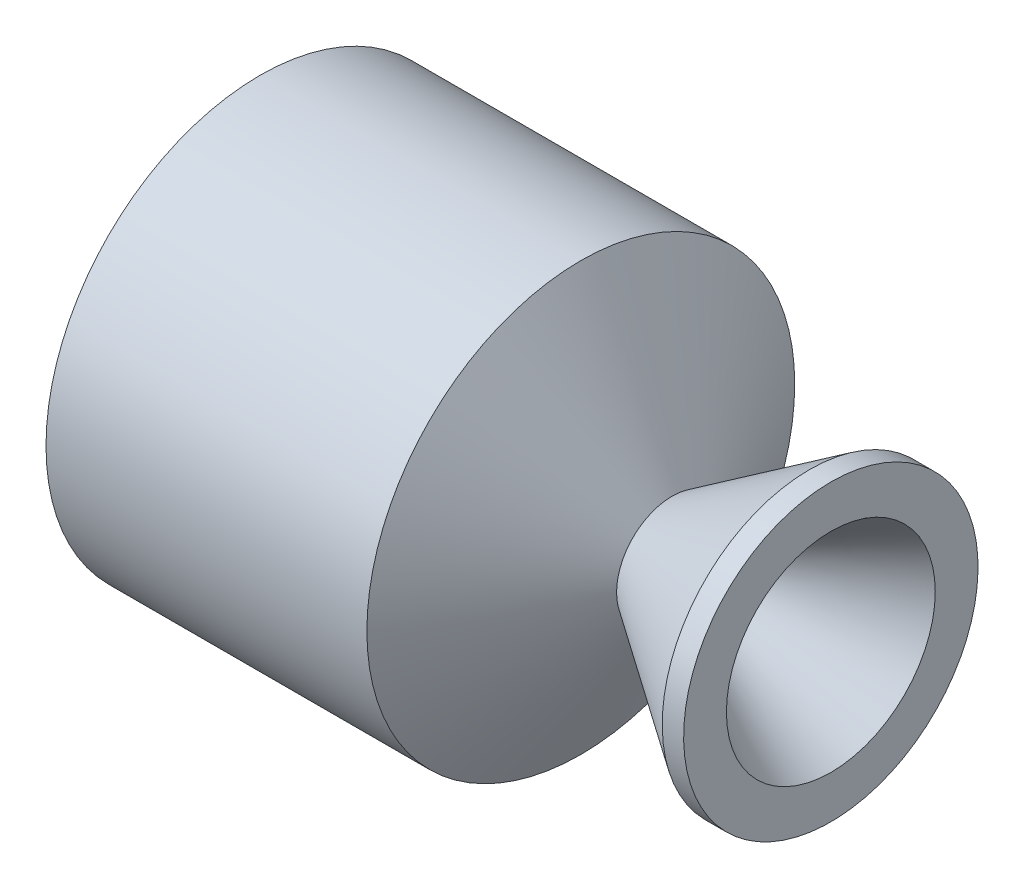
ISO-10303-21;
HEADER;
FILE_DESCRIPTION(('STEP AP214'),'2;1');
FILE_NAME('part.step','',(''),(''),'','','');
FILE_SCHEMA(('AUTOMOTIVE_DESIGN { 1 0 10303 214 1 1 1 1 }'));
ENDSEC;
DATA;
#1=APPLICATION_CONTEXT('core data for automotive mechanical design processes');
#2=APPLICATION_PROTOCOL_DEFINITION('international standard','automotive_design',2000,#1);
#3=PRODUCT_CONTEXT('',#1,'mechanical');
#4=PRODUCT('Part','Part','',(#3));
#5=PRODUCT_RELATED_PRODUCT_CATEGORY('part','',(#4));
#6=PRODUCT_DEFINITION_FORMATION('','',#4);
#7=PRODUCT_DEFINITION_CONTEXT('part definition',#1,'design');
#8=PRODUCT_DEFINITION('design','',#6,#7);
#9=PRODUCT_DEFINITION_SHAPE('','',#8);
#10=(LENGTH_UNIT() NAMED_UNIT(*) SI_UNIT(.MILLI.,.METRE.));
#11=(NAMED_UNIT(*) PLANE_ANGLE_UNIT() SI_UNIT($,.RADIAN.));
#12=(NAMED_UNIT(*) SI_UNIT($,.STERADIAN.) SOLID_ANGLE_UNIT());
#13=UNCERTAINTY_MEASURE_WITH_UNIT(LENGTH_MEASURE(1.E-05),#10,'distance_accuracy_value','');
#14=(GEOMETRIC_REPRESENTATION_CONTEXT(3) GLOBAL_UNCERTAINTY_ASSIGNED_CONTEXT((#13)) GLOBAL_UNIT_ASSIGNED_CONTEXT((#10,
#11,#12)) REPRESENTATION_CONTEXT('',''));
#15=CARTESIAN_POINT('',(0.,0.,0.));
#16=DIRECTION('',(0.,0.,1.));
#17=DIRECTION('',(1.,0.,0.));
#18=AXIS2_PLACEMENT_3D('',#15,#16,#17);
#19=CARTESIAN_POINT('',(-4.84974226119283,0.,0.));
#20=DIRECTION('',(-1.,0.,0.));
#21=DIRECTION('',(0.,-1.,0.));
#22=AXIS2_PLACEMENT_3D('',#19,#20,#21);
#23=CONICAL_SURFACE('',#22,8.99999999999999,1.0471975511966);
#24=CARTESIAN_POINT('',(0.,0.,0.));
#25=DIRECTION('',(1.,0.,0.));
#26=DIRECTION('',(0.,1.,0.));
#27=AXIS2_PLACEMENT_3D('',#24,#25,#26);
#28=CIRCLE('',#27,0.6);
#29=CARTESIAN_POINT('',(0.,-0.599999999999998,0.));
#30=VERTEX_POINT('',#29);
#31=EDGE_CURVE('E90',#30,#30,#28,.T.);
#32=CARTESIAN_POINT('',(-4.84974226119283,0.,0.));
#33=DIRECTION('',(1.,0.,0.));
#34=DIRECTION('',(0.,1.,0.));
#35=AXIS2_PLACEMENT_3D('',#32,#33,#34);
#36=CIRCLE('',#35,9.);
#37=CARTESIAN_POINT('',(-4.84974226119283,-8.99999999999999,0.));
#38=VERTEX_POINT('',#37);
#39=EDGE_CURVE('E10',#38,#38,#36,.T.);
#40=CARTESIAN_POINT('',(0.,-0.599999999999998,0.));
#41=CARTESIAN_POINT('',(-0.0505181485540921,-0.687499999999998,0.));
#42=CARTESIAN_POINT('',(-0.101036297108184,-0.774999999999999,0.));
#43=CARTESIAN_POINT('',(-0.202072594216368,-0.949999999999999,0.));
#44=CARTESIAN_POINT('',(-0.25259074277046,-1.0375,0.));
#45=CARTESIAN_POINT('',(-0.353627039878644,-1.2125,0.));
#46=CARTESIAN_POINT('',(-0.404145188432736,-1.3,0.));
#47=CARTESIAN_POINT('',(-0.505181485540919,-1.475,0.));
#48=CARTESIAN_POINT('',(-0.555699634095012,-1.5625,0.));
#49=CARTESIAN_POINT('',(-0.656735931203196,-1.7375,0.));
#50=CARTESIAN_POINT('',(-0.707254079757288,-1.825,0.));
#51=CARTESIAN_POINT('',(-0.808290376865472,-2.,0.));
#52=CARTESIAN_POINT('',(-0.858808525419564,-2.0875,0.));
#53=CARTESIAN_POINT('',(-0.959844822527748,-2.2625,0.));
#54=CARTESIAN_POINT('',(-1.01036297108184,-2.35,0.));
#55=CARTESIAN_POINT('',(-1.11139926819002,-2.525,0.));
#56=CARTESIAN_POINT('',(-1.16191741674412,-2.6125,0.));
#57=CARTESIAN_POINT('',(-1.2629537138523,-2.7875,0.));
#58=CARTESIAN_POINT('',(-1.31347186240639,-2.875,0.));
#59=CARTESIAN_POINT('',(-1.41450815951458,-3.05,0.));
#60=CARTESIAN_POINT('',(-1.46502630806867,-3.1375,0.));
#61=CARTESIAN_POINT('',(-1.56606260517685,-3.3125,0.));
#62=CARTESIAN_POINT('',(-1.61658075373094,-3.4,0.));
#63=CARTESIAN_POINT('',(-1.71761705083913,-3.575,0.));
#64=CARTESIAN_POINT('',(-1.76813519939322,-3.6625,0.));
#65=CARTESIAN_POINT('',(-1.8691714965014,-3.8375,0.));
#66=CARTESIAN_POINT('',(-1.9196896450555,-3.925,0.));
#67=CARTESIAN_POINT('',(-2.02072594216368,-4.1,0.));
#68=CARTESIAN_POINT('',(-2.07124409071777,-4.1875,0.));
#69=CARTESIAN_POINT('',(-2.17228038782596,-4.3625,0.));
#70=CARTESIAN_POINT('',(-2.22279853638005,-4.45,0.));
#71=CARTESIAN_POINT('',(-2.32383483348823,-4.625,0.));
#72=CARTESIAN_POINT('',(-2.37435298204232,-4.7125,0.));
#73=CARTESIAN_POINT('',(-2.47538927915051,-4.8875,0.));
#74=CARTESIAN_POINT('',(-2.5259074277046,-4.975,0.));
#75=CARTESIAN_POINT('',(-2.62694372481278,-5.15,0.));
#76=CARTESIAN_POINT('',(-2.67746187336688,-5.23749999999999,0.));
#77=CARTESIAN_POINT('',(-2.77849817047506,-5.41249999999999,0.));
#78=CARTESIAN_POINT('',(-2.82901631902915,-5.49999999999999,0.));
#79=CARTESIAN_POINT('',(-2.93005261613734,-5.67499999999999,0.));
#80=CARTESIAN_POINT('',(-2.98057076469143,-5.76249999999999,0.));
#81=CARTESIAN_POINT('',(-3.08160706179961,-5.93749999999999,0.));
#82=CARTESIAN_POINT('',(-3.1321252103537,-6.025,0.));
#83=CARTESIAN_POINT('',(-3.23316150746189,-6.19999999999999,0.));
#84=CARTESIAN_POINT('',(-3.28367965601598,-6.28749999999999,0.));
#85=CARTESIAN_POINT('',(-3.38471595312416,-6.46249999999999,0.));
#86=CARTESIAN_POINT('',(-3.43523410167826,-6.54999999999999,0.));
#87=CARTESIAN_POINT('',(-3.53627039878644,-6.72499999999999,0.));
#88=CARTESIAN_POINT('',(-3.58678854734053,-6.81249999999999,0.));
#89=CARTESIAN_POINT('',(-3.68782484444872,-6.98749999999999,0.));
#90=CARTESIAN_POINT('',(-3.73834299300281,-7.07499999999999,0.));
#91=CARTESIAN_POINT('',(-3.83937929011099,-7.24999999999999,0.));
#92=CARTESIAN_POINT('',(-3.88989743866508,-7.33749999999999,0.));
#93=CARTESIAN_POINT('',(-3.99093373577327,-7.51249999999999,0.));
#94=CARTESIAN_POINT('',(-4.04145188432736,-7.59999999999999,0.));
#95=CARTESIAN_POINT('',(-4.14248818143554,-7.77499999999999,0.));
#96=CARTESIAN_POINT('',(-4.19300632998964,-7.86249999999999,0.));
#97=CARTESIAN_POINT('',(-4.29404262709782,-8.03749999999999,0.));
#98=CARTESIAN_POINT('',(-4.34456077565191,-8.12499999999999,0.));
#99=CARTESIAN_POINT('',(-4.4455970727601,-8.29999999999999,0.));
#100=CARTESIAN_POINT('',(-4.49611522131419,-8.38749999999999,0.));
#101=CARTESIAN_POINT('',(-4.59715151842237,-8.56249999999999,0.));
#102=CARTESIAN_POINT('',(-4.64766966697646,-8.64999999999999,0.));
#103=CARTESIAN_POINT('',(-4.74870596408465,-8.82499999999999,0.));
#104=CARTESIAN_POINT('',(-4.79922411263874,-8.91249999999999,0.));
#105=CARTESIAN_POINT('',(-4.84974226119283,-8.99999999999999,0.));
#106=B_SPLINE_CURVE_WITH_KNOTS('',3,(#40,#41,#42,#43,#44,#45,#46,#47,#48,#49,#50,#51,#52,#53,
#54,#55,#56,#57,#58,#59,#60,#61,#62,#63,#64,#65,#66,#67,#68,#69,#70,#71,#72,#73,#74,#75,#76,#77,
#78,#79,#80,#81,#82,#83,#84,#85,#86,#87,#88,#89,#90,#91,#92,#93,#94,#95,#96,#97,#98,#99,#100,
#101,#102,#103,#104,#105),.UNSPECIFIED.,.F.,.F.,(4,2,2,2,2,2,2,2,2,2,2,2,2,2,2,2,2,2,2,2,2,2,2,
2,2,2,2,2,2,2,2,2,4),(0.,0.303108891324554,0.606217782649107,0.909326673973658,1.21243556529821,
1.51554445662276,1.81865334794732,2.12176223927187,2.42487113059642,2.72798002192098,
3.03108891324553,3.33419780457008,3.63730669589464,3.94041558721919,4.24352447854374,
4.54663336986829,4.84974226119285,5.1528511525174,5.45596004384195,5.75906893516651,
6.06217782649106,6.36528671781561,6.66839560914017,6.97150450046472,7.27461339178927,
7.57772228311383,7.88083117443838,8.18394006576293,8.48704895708748,8.79015784841204,
9.09326673973659,9.39637563106114,9.6994845223857),.UNSPECIFIED.);
#107=EDGE_CURVE('BSEAM43',#30,#38,#106,.T.);
#108=ORIENTED_EDGE('',*,*,#31,.T.);
#109=ORIENTED_EDGE('',*,*,#39,.F.);
#110=ORIENTED_EDGE('',*,*,#107,.T.);
#111=ORIENTED_EDGE('',*,*,#107,.F.);
#112=EDGE_LOOP('',(#108,#110,#109,#111));
#113=FACE_BOUND('',#112,.T.);
#114=ADVANCED_FACE('F43',(#113),#23,.F.);
#115=CARTESIAN_POINT('',(7.41583083989624,0.,0.));
#116=DIRECTION('',(1.,0.,0.));
#117=DIRECTION('',(0.,1.,0.));
#118=AXIS2_PLACEMENT_3D('',#115,#116,#117);
#119=CYLINDRICAL_SURFACE('',#118,8.99999999999999);
#120=ORIENTED_EDGE('',*,*,#39,.T.);
#121=EDGE_LOOP('',(#120));
#122=FACE_BOUND('',#121,.T.);
#123=CARTESIAN_POINT('',(-18.2723919920032,0.,0.));
#124=DIRECTION('',(1.,0.,0.));
#125=DIRECTION('',(0.,1.,0.));
#126=AXIS2_PLACEMENT_3D('',#123,#124,#125);
#127=CIRCLE('',#126,8.99999999999999);
#128=CARTESIAN_POINT('',(-18.2723919920032,9.,0.));
#129=VERTEX_POINT('',#128);
#130=EDGE_CURVE('E50',#129,#129,#127,.T.);
#131=ORIENTED_EDGE('',*,*,#130,.F.);
#132=EDGE_LOOP('',(#131));
#133=FACE_BOUND('',#132,.T.);
#134=ADVANCED_FACE('F109',(#122,#133),#119,.F.);
#135=CARTESIAN_POINT('',(-18.2723919920032,9.,0.));
#136=DIRECTION('',(1.,0.,0.));
#137=DIRECTION('',(0.,1.,0.));
#138=AXIS2_PLACEMENT_3D('',#135,#136,#137);
#139=PLANE('',#138);
#140=ORIENTED_EDGE('',*,*,#130,.T.);
#141=EDGE_LOOP('',(#140));
#142=FACE_BOUND('',#141,.T.);
#143=CARTESIAN_POINT('',(-18.2723919920032,0.,0.));
#144=DIRECTION('',(1.,0.,0.));
#145=DIRECTION('',(0.,1.,0.));
#146=AXIS2_PLACEMENT_3D('',#143,#144,#145);
#147=CIRCLE('',#146,0.599999999999996);
#148=CARTESIAN_POINT('',(-18.2723919920032,0.6,0.));
#149=VERTEX_POINT('',#148);
#150=EDGE_CURVE('E55',#149,#149,#147,.T.);
#151=ORIENTED_EDGE('',*,*,#150,.F.);
#152=EDGE_LOOP('',(#151));
#153=FACE_BOUND('',#152,.T.);
#154=ADVANCED_FACE('F113',(#142,#153),#139,.T.);
#155=CARTESIAN_POINT('',(7.41583083989624,0.,0.));
#156=DIRECTION('',(1.,0.,0.));
#157=DIRECTION('',(0.,1.,0.));
#158=AXIS2_PLACEMENT_3D('',#155,#156,#157);
#159=CYLINDRICAL_SURFACE('',#158,0.599999999999996);
#160=ORIENTED_EDGE('',*,*,#150,.T.);
#161=EDGE_LOOP('',(#160));
#162=FACE_BOUND('',#161,.T.);
#163=CARTESIAN_POINT('',(-19.2723919920032,0.,0.));
#164=DIRECTION('',(1.,0.,0.));
#165=DIRECTION('',(0.,1.,0.));
#166=AXIS2_PLACEMENT_3D('',#163,#164,#165);
#167=CIRCLE('',#166,0.599999999999996);
#168=CARTESIAN_POINT('',(-19.2723919920032,0.6,0.));
#169=VERTEX_POINT('',#168);
#170=EDGE_CURVE('E60',#169,#169,#167,.T.);
#171=ORIENTED_EDGE('',*,*,#170,.F.);
#172=EDGE_LOOP('',(#171));
#173=FACE_BOUND('',#172,.T.);
#174=ADVANCED_FACE('F117',(#162,#173),#159,.F.);
#175=CARTESIAN_POINT('',(-19.2723919920032,10.,0.));
#176=DIRECTION('',(-1.,0.,0.));
#177=DIRECTION('',(0.,-1.,0.));
#178=AXIS2_PLACEMENT_3D('',#175,#176,#177);
#179=PLANE('',#178);
#180=ORIENTED_EDGE('',*,*,#170,.T.);
#181=EDGE_LOOP('',(#180));
#182=FACE_BOUND('',#181,.T.);
#183=CARTESIAN_POINT('',(-19.2723919920032,0.,0.));
#184=DIRECTION('',(1.,0.,0.));
#185=DIRECTION('',(0.,1.,0.));
#186=AXIS2_PLACEMENT_3D('',#183,#184,#185);
#187=CIRCLE('',#186,9.99999999999999);
#188=CARTESIAN_POINT('',(-19.2723919920032,10.,0.));
#189=VERTEX_POINT('',#188);
#190=EDGE_CURVE('E66',#189,#189,#187,.T.);
#191=ORIENTED_EDGE('',*,*,#190,.F.);
#192=EDGE_LOOP('',(#191));
#193=FACE_BOUND('',#192,.T.);
#194=ADVANCED_FACE('F123',(#182,#193),#179,.T.);
#195=CARTESIAN_POINT('',(7.41583083989624,0.,0.));
#196=DIRECTION('',(1.,0.,0.));
#197=DIRECTION('',(0.,1.,0.));
#198=AXIS2_PLACEMENT_3D('',#195,#196,#197);
#199=CYLINDRICAL_SURFACE('',#198,9.99999999999999);
#200=ORIENTED_EDGE('',*,*,#190,.T.);
#201=EDGE_LOOP('',(#200));
#202=FACE_BOUND('',#201,.T.);
#203=CARTESIAN_POINT('',(-4.27239199200321,0.,0.));
#204=DIRECTION('',(1.,0.,0.));
#205=DIRECTION('',(0.,1.,0.));
#206=AXIS2_PLACEMENT_3D('',#203,#204,#205);
#207=CIRCLE('',#206,10.);
#208=CARTESIAN_POINT('',(-4.27239199200321,-10.,0.));
#209=VERTEX_POINT('',#208);
#210=EDGE_CURVE('E70',#209,#209,#207,.T.);
#211=ORIENTED_EDGE('',*,*,#210,.F.);
#212=EDGE_LOOP('',(#211));
#213=FACE_BOUND('',#212,.T.);
#214=ADVANCED_FACE('F127',(#202,#213),#199,.T.);
#215=CARTESIAN_POINT('',(0.,0.,0.));
#216=DIRECTION('',(-1.,0.,0.));
#217=DIRECTION('',(0.,-1.,0.));
#218=AXIS2_PLACEMENT_3D('',#215,#216,#217);
#219=CONICAL_SURFACE('',#218,2.6,1.0471975511966);
#220=CARTESIAN_POINT('',(0.,0.,0.));
#221=DIRECTION('',(1.,0.,0.));
#222=DIRECTION('',(0.,1.,0.));
#223=AXIS2_PLACEMENT_3D('',#220,#221,#222);
#224=CIRCLE('',#223,2.6);
#225=CARTESIAN_POINT('',(0.,-2.6,0.));
#226=VERTEX_POINT('',#225);
#227=EDGE_CURVE('E74',#226,#226,#224,.T.);
#228=CARTESIAN_POINT('',(-4.27239199200321,-10.,0.));
#229=CARTESIAN_POINT('',(-4.22788790875318,-9.92291666666667,0.));
#230=CARTESIAN_POINT('',(-4.18338382550315,-9.84583333333333,0.));
#231=CARTESIAN_POINT('',(-4.09437565900308,-9.69166666666667,0.));
#232=CARTESIAN_POINT('',(-4.04987157575304,-9.61458333333333,0.));
#233=CARTESIAN_POINT('',(-3.96086340925298,-9.46041666666666,0.));
#234=CARTESIAN_POINT('',(-3.91635932600294,-9.38333333333333,0.));
#235=CARTESIAN_POINT('',(-3.82735115950288,-9.22916666666666,0.));
#236=CARTESIAN_POINT('',(-3.78284707625284,-9.15208333333333,0.));
#237=CARTESIAN_POINT('',(-3.69383890975278,-8.99791666666667,0.));
#238=CARTESIAN_POINT('',(-3.64933482650274,-8.92083333333333,0.));
#239=CARTESIAN_POINT('',(-3.56032666000268,-8.76666666666667,0.));
#240=CARTESIAN_POINT('',(-3.51582257675264,-8.68958333333333,0.));
#241=CARTESIAN_POINT('',(-3.42681441025258,-8.53541666666666,0.));
#242=CARTESIAN_POINT('',(-3.38231032700254,-8.45833333333333,0.));
#243=CARTESIAN_POINT('',(-3.29330216050248,-8.30416666666667,0.));
#244=CARTESIAN_POINT('',(-3.24879807725244,-8.22708333333333,0.));
#245=CARTESIAN_POINT('',(-3.15978991075238,-8.07291666666667,0.));
#246=CARTESIAN_POINT('',(-3.11528582750234,-7.99583333333333,0.));
#247=CARTESIAN_POINT('',(-3.02627766100228,-7.84166666666667,0.));
#248=CARTESIAN_POINT('',(-2.98177357775224,-7.76458333333333,0.));
#249=CARTESIAN_POINT('',(-2.89276541125218,-7.61041666666667,0.));
#250=CARTESIAN_POINT('',(-2.84826132800214,-7.53333333333333,0.));
#251=CARTESIAN_POINT('',(-2.75925316150208,-7.37916666666667,0.));
#252=CARTESIAN_POINT('',(-2.71474907825204,-7.30208333333333,0.));
#253=CARTESIAN_POINT('',(-2.62574091175197,-7.14791666666667,0.));
#254=CARTESIAN_POINT('',(-2.58123682850194,-7.07083333333333,0.));
#255=CARTESIAN_POINT('',(-2.49222866200187,-6.91666666666666,0.));
#256=CARTESIAN_POINT('',(-2.44772457875184,-6.83958333333333,0.));
#257=CARTESIAN_POINT('',(-2.35871641225177,-6.68541666666667,0.));
#258=CARTESIAN_POINT('',(-2.31421232900174,-6.60833333333333,0.));
#259=CARTESIAN_POINT('',(-2.22520416250167,-6.45416666666667,0.));
#260=CARTESIAN_POINT('',(-2.18070007925164,-6.37708333333333,0.));
#261=CARTESIAN_POINT('',(-2.09169191275157,-6.22291666666667,0.));
#262=CARTESIAN_POINT('',(-2.04718782950154,-6.14583333333333,0.));
#263=CARTESIAN_POINT('',(-1.95817966300147,-5.99166666666667,0.));
#264=CARTESIAN_POINT('',(-1.91367557975144,-5.91458333333333,0.));
#265=CARTESIAN_POINT('',(-1.82466741325137,-5.76041666666667,0.));
#266=CARTESIAN_POINT('',(-1.78016333000134,-5.68333333333333,0.));
#267=CARTESIAN_POINT('',(-1.69115516350127,-5.52916666666667,0.));
#268=CARTESIAN_POINT('',(-1.64665108025124,-5.45208333333333,0.));
#269=CARTESIAN_POINT('',(-1.55764291375117,-5.29791666666667,0.));
#270=CARTESIAN_POINT('',(-1.51313883050114,-5.22083333333333,0.));
#271=CARTESIAN_POINT('',(-1.42413066400107,-5.06666666666667,0.));
#272=CARTESIAN_POINT('',(-1.37962658075104,-4.98958333333333,0.));
#273=CARTESIAN_POINT('',(-1.29061841425097,-4.83541666666667,0.));
#274=CARTESIAN_POINT('',(-1.24611433100094,-4.75833333333333,0.));
#275=CARTESIAN_POINT('',(-1.15710616450087,-4.60416666666667,0.));
#276=CARTESIAN_POINT('',(-1.11260208125084,-4.52708333333333,0.));
#277=CARTESIAN_POINT('',(-1.02359391475077,-4.37291666666667,0.));
#278=CARTESIAN_POINT('',(-0.979089831500737,-4.29583333333333,0.));
#279=CARTESIAN_POINT('',(-0.89008166500067,-4.14166666666667,0.));
#280=CARTESIAN_POINT('',(-0.845577581750637,-4.06458333333333,0.));
#281=CARTESIAN_POINT('',(-0.75656941525057,-3.91041666666667,0.));
#282=CARTESIAN_POINT('',(-0.712065332000537,-3.83333333333333,0.));
#283=CARTESIAN_POINT('',(-0.62305716550047,-3.67916666666667,0.));
#284=CARTESIAN_POINT('',(-0.578553082250436,-3.60208333333333,0.));
#285=CARTESIAN_POINT('',(-0.489544915750369,-3.44791666666667,0.));
#286=CARTESIAN_POINT('',(-0.445040832500336,-3.37083333333333,0.));
#287=CARTESIAN_POINT('',(-0.356032666000269,-3.21666666666667,0.));
#288=CARTESIAN_POINT('',(-0.311528582750236,-3.13958333333333,0.));
#289=CARTESIAN_POINT('',(-0.222520416250169,-2.98541666666667,0.));
#290=CARTESIAN_POINT('',(-0.178016333000135,-2.90833333333333,0.));
#291=CARTESIAN_POINT('',(-0.0890081665000683,-2.75416666666667,0.));
#292=CARTESIAN_POINT('',(-0.0445040832500348,-2.67708333333333,0.));
#293=CARTESIAN_POINT('',(0.,-2.6,0.));
#294=B_SPLINE_CURVE_WITH_KNOTS('',3,(#228,#229,#230,#231,#232,#233,#234,#235,#236,#237,#238,
#239,#240,#241,#242,#243,#244,#245,#246,#247,#248,#249,#250,#251,#252,#253,#254,#255,#256,#257,
#258,#259,#260,#261,#262,#263,#264,#265,#266,#267,#268,#269,#270,#271,#272,#273,#274,#275,#276,
#277,#278,#279,#280,#281,#282,#283,#284,#285,#286,#287,#288,#289,#290,#291,#292,#293),
.UNSPECIFIED.,.F.,.F.,(4,2,2,2,2,2,2,2,2,2,2,2,2,2,2,2,2,2,2,2,2,2,2,2,2,2,2,2,2,2,2,2,4),(0.,
0.267024499500201,0.534048999000404,0.801073498500605,1.06809799800081,1.33512249750101,
1.60214699700121,1.86917149650141,2.13619599600161,2.40322049550181,2.67024499500202,
2.93726949450222,3.20429399400242,3.47131849350262,3.73834299300282,4.00536749250302,
4.27239199200322,4.53941649150343,4.80644099100363,5.07346549050383,5.34048999000403,
5.60751448950423,5.87453898900443,6.14156348850463,6.40858798800483,6.67561248750504,
6.94263698700524,7.20966148650544,7.47668598600564,7.74371048550584,8.01073498500604,
8.27775948450624,8.54478398400645),.UNSPECIFIED.);
#295=EDGE_CURVE('BSEAM131',#209,#226,#294,.T.);
#296=ORIENTED_EDGE('',*,*,#210,.T.);
#297=ORIENTED_EDGE('',*,*,#227,.F.);
#298=ORIENTED_EDGE('',*,*,#295,.T.);
#299=ORIENTED_EDGE('',*,*,#295,.F.);
#300=EDGE_LOOP('',(#296,#298,#297,#299));
#301=FACE_BOUND('',#300,.T.);
#302=ADVANCED_FACE('F131',(#301),#219,.T.);
#303=CARTESIAN_POINT('',(6.41583083989624,0.,0.));
#304=DIRECTION('',(1.,0.,0.));
#305=DIRECTION('',(0.,1.,0.));
#306=AXIS2_PLACEMENT_3D('',#303,#304,#305);
#307=CONICAL_SURFACE('',#306,6.88153193167882,0.588467682855342);
#308=ORIENTED_EDGE('',*,*,#227,.T.);
#309=EDGE_LOOP('',(#308));
#310=FACE_BOUND('',#309,.T.);
#311=CARTESIAN_POINT('',(6.41583083989624,0.,0.));
#312=DIRECTION('',(1.,0.,0.));
#313=DIRECTION('',(0.,1.,0.));
#314=AXIS2_PLACEMENT_3D('',#311,#312,#313);
#315=CIRCLE('',#314,6.88153193167882);
#316=CARTESIAN_POINT('',(6.41583083989624,6.88153193167882,0.));
#317=VERTEX_POINT('',#316);
#318=EDGE_CURVE('E78',#317,#317,#315,.T.);
#319=ORIENTED_EDGE('',*,*,#318,.F.);
#320=EDGE_LOOP('',(#319));
#321=FACE_BOUND('',#320,.T.);
#322=ADVANCED_FACE('F135',(#310,#321),#307,.T.);
#323=CARTESIAN_POINT('',(7.41583083989624,0.,0.));
#324=DIRECTION('',(1.,0.,0.));
#325=DIRECTION('',(0.,1.,0.));
#326=AXIS2_PLACEMENT_3D('',#323,#324,#325);
#327=CYLINDRICAL_SURFACE('',#326,6.88153193167882);
#328=ORIENTED_EDGE('',*,*,#318,.T.);
#329=EDGE_LOOP('',(#328));
#330=FACE_BOUND('',#329,.T.);
#331=CARTESIAN_POINT('',(7.41583083989624,0.,0.));
#332=DIRECTION('',(1.,0.,0.));
#333=DIRECTION('',(0.,1.,0.));
#334=AXIS2_PLACEMENT_3D('',#331,#332,#333);
#335=CIRCLE('',#334,6.88153193167882);
#336=CARTESIAN_POINT('',(7.41583083989624,6.88153193167882,0.));
#337=VERTEX_POINT('',#336);
#338=EDGE_CURVE('E82',#337,#337,#335,.T.);
#339=ORIENTED_EDGE('',*,*,#338,.F.);
#340=EDGE_LOOP('',(#339));
#341=FACE_BOUND('',#340,.T.);
#342=ADVANCED_FACE('F105',(#330,#341),#327,.T.);
#343=CARTESIAN_POINT('',(7.41583083989624,4.88153193167882,0.));
#344=DIRECTION('',(1.,0.,0.));
#345=DIRECTION('',(0.,1.,0.));
#346=AXIS2_PLACEMENT_3D('',#343,#344,#345);
#347=PLANE('',#346);
#348=ORIENTED_EDGE('',*,*,#338,.T.);
#349=EDGE_LOOP('',(#348));
#350=FACE_BOUND('',#349,.T.);
#351=CARTESIAN_POINT('',(7.41583083989624,0.,0.));
#352=DIRECTION('',(1.,0.,0.));
#353=DIRECTION('',(0.,1.,0.));
#354=AXIS2_PLACEMENT_3D('',#351,#352,#353);
#355=CIRCLE('',#354,4.88153193167882);
#356=CARTESIAN_POINT('',(7.41583083989624,4.88153193167882,0.));
#357=VERTEX_POINT('',#356);
#358=EDGE_CURVE('E86',#357,#357,#355,.T.);
#359=ORIENTED_EDGE('',*,*,#358,.F.);
#360=EDGE_LOOP('',(#359));
#361=FACE_BOUND('',#360,.T.);
#362=ADVANCED_FACE('F99',(#350,#361),#347,.T.);
#363=CARTESIAN_POINT('',(0.,0.,0.));
#364=DIRECTION('',(1.,0.,0.));
#365=DIRECTION('',(0.,1.,0.));
#366=AXIS2_PLACEMENT_3D('',#363,#364,#365);
#367=CONICAL_SURFACE('',#366,0.6,0.523598775598299);
#368=ORIENTED_EDGE('',*,*,#358,.T.);
#369=EDGE_LOOP('',(#368));
#370=FACE_BOUND('',#369,.T.);
#371=ORIENTED_EDGE('',*,*,#31,.F.);
#372=EDGE_LOOP('',(#371));
#373=FACE_BOUND('',#372,.T.);
#374=ADVANCED_FACE('F97',(#370,#373),#367,.F.);
#375=CLOSED_SHELL('',(#114,#134,#154,#174,#194,#214,#302,#322,#342,#362,#374));
#376=MANIFOLD_SOLID_BREP('B2',#375);
#377=ADVANCED_BREP_SHAPE_REPRESENTATION('',(#18,#376),#14);
#378=SHAPE_DEFINITION_REPRESENTATION(#9,#377);
ENDSEC;
END-ISO-10303-21;
